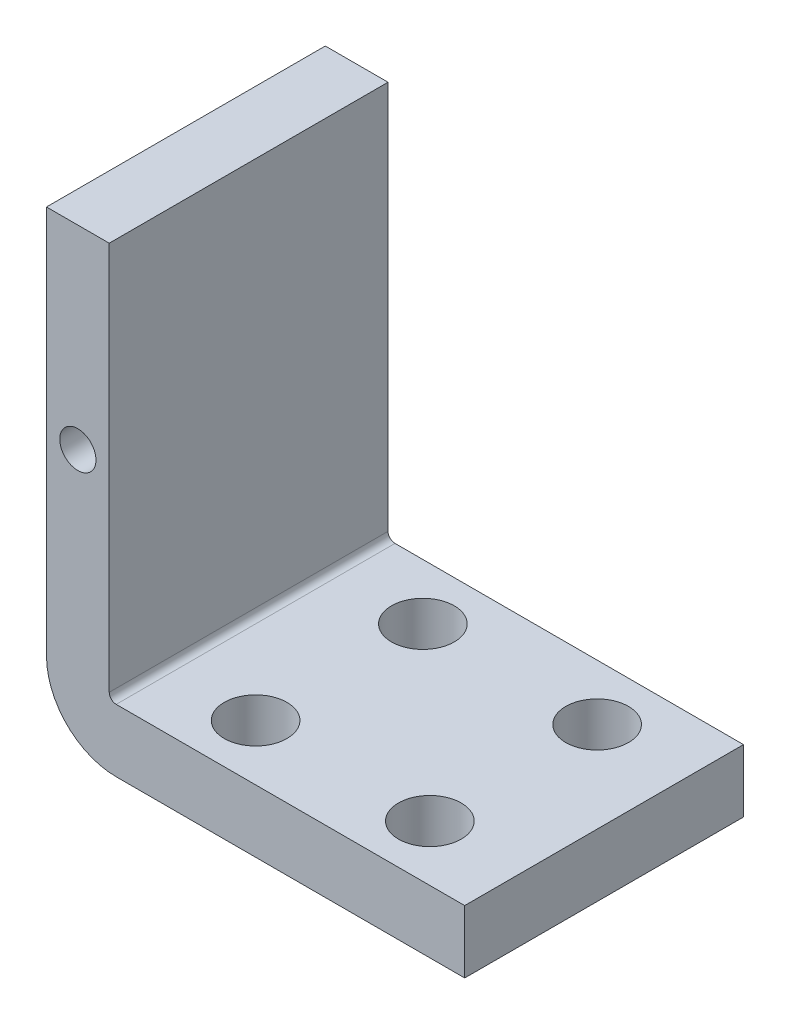
ISO-10303-21;
HEADER;
FILE_DESCRIPTION(('STEP AP214'),'2;1');
FILE_NAME('part.step','',(''),(''),'','','');
FILE_SCHEMA(('AUTOMOTIVE_DESIGN { 1 0 10303 214 1 1 1 1 }'));
ENDSEC;
DATA;
#1=APPLICATION_CONTEXT('core data for automotive mechanical design processes');
#2=APPLICATION_PROTOCOL_DEFINITION('international standard','automotive_design',2000,#1);
#3=PRODUCT_CONTEXT('',#1,'mechanical');
#4=PRODUCT('Part','Part','',(#3));
#5=PRODUCT_RELATED_PRODUCT_CATEGORY('part','',(#4));
#6=PRODUCT_DEFINITION_FORMATION('','',#4);
#7=PRODUCT_DEFINITION_CONTEXT('part definition',#1,'design');
#8=PRODUCT_DEFINITION('design','',#6,#7);
#9=PRODUCT_DEFINITION_SHAPE('','',#8);
#10=(LENGTH_UNIT() NAMED_UNIT(*) SI_UNIT(.MILLI.,.METRE.));
#11=(NAMED_UNIT(*) PLANE_ANGLE_UNIT() SI_UNIT($,.RADIAN.));
#12=(NAMED_UNIT(*) SI_UNIT($,.STERADIAN.) SOLID_ANGLE_UNIT());
#13=UNCERTAINTY_MEASURE_WITH_UNIT(LENGTH_MEASURE(1.E-05),#10,'distance_accuracy_value','');
#14=(GEOMETRIC_REPRESENTATION_CONTEXT(3) GLOBAL_UNCERTAINTY_ASSIGNED_CONTEXT((#13)) GLOBAL_UNIT_ASSIGNED_CONTEXT((#10,
#11,#12)) REPRESENTATION_CONTEXT('',''));
#15=CARTESIAN_POINT('',(0.,0.,0.));
#16=DIRECTION('',(0.,0.,1.));
#17=DIRECTION('',(1.,0.,0.));
#18=AXIS2_PLACEMENT_3D('',#15,#16,#17);
#19=CARTESIAN_POINT('',(0.,-27.9,20.));
#20=DIRECTION('',(0.,0.,1.));
#21=DIRECTION('',(1.,0.,0.));
#22=AXIS2_PLACEMENT_3D('',#19,#20,#21);
#23=PLANE('',#22);
#24=CARTESIAN_POINT('',(5.,-27.9,20.));
#25=DIRECTION('',(0.,0.,1.));
#26=DIRECTION('',(1.,0.,0.));
#27=AXIS2_PLACEMENT_3D('',#24,#25,#26);
#28=CIRCLE('',#27,0.5);
#29=CARTESIAN_POINT('',(4.5,-27.9,20.));
#30=VERTEX_POINT('',#29);
#31=CARTESIAN_POINT('',(5.,-28.4,20.));
#32=VERTEX_POINT('',#31);
#33=EDGE_CURVE('E138',#30,#32,#28,.T.);
#34=ORIENTED_EDGE('',*,*,#33,.F.);
#35=DIRECTION('',(0.,-1.,0.));
#36=VECTOR('',#35,1.);
#37=CARTESIAN_POINT('',(4.5,0.,20.));
#38=LINE('',#37,#36);
#39=CARTESIAN_POINT('',(4.5,0.,20.));
#40=VERTEX_POINT('',#39);
#41=EDGE_CURVE('E144',#40,#30,#38,.T.);
#42=ORIENTED_EDGE('',*,*,#41,.F.);
#43=DIRECTION('',(1.,0.,0.));
#44=VECTOR('',#43,1.);
#45=CARTESIAN_POINT('',(0.,0.,20.));
#46=LINE('',#45,#44);
#47=CARTESIAN_POINT('',(0.,0.,20.));
#48=VERTEX_POINT('',#47);
#49=EDGE_CURVE('E103',#48,#40,#46,.T.);
#50=ORIENTED_EDGE('',*,*,#49,.F.);
#51=DIRECTION('',(0.,-1.,0.));
#52=VECTOR('',#51,1.);
#53=CARTESIAN_POINT('',(0.,0.,20.));
#54=LINE('',#53,#52);
#55=CARTESIAN_POINT('',(0.,-27.9,20.));
#56=VERTEX_POINT('',#55);
#57=EDGE_CURVE('E25',#48,#56,#54,.T.);
#58=ORIENTED_EDGE('',*,*,#57,.T.);
#59=CARTESIAN_POINT('',(5.,-27.9,20.));
#60=DIRECTION('',(0.,0.,1.));
#61=DIRECTION('',(0.,-1.,0.));
#62=AXIS2_PLACEMENT_3D('',#59,#60,#61);
#63=CIRCLE('',#62,5.);
#64=CARTESIAN_POINT('',(5.,-32.9,20.));
#65=VERTEX_POINT('',#64);
#66=EDGE_CURVE('E9',#56,#65,#63,.T.);
#67=ORIENTED_EDGE('',*,*,#66,.T.);
#68=DIRECTION('',(1.,0.,0.));
#69=VECTOR('',#68,1.);
#70=CARTESIAN_POINT('',(5.,-32.9,20.));
#71=LINE('',#70,#69);
#72=CARTESIAN_POINT('',(30.,-32.9,20.));
#73=VERTEX_POINT('',#72);
#74=EDGE_CURVE('E106',#65,#73,#71,.T.);
#75=ORIENTED_EDGE('',*,*,#74,.T.);
#76=DIRECTION('',(0.,-1.,0.));
#77=VECTOR('',#76,1.);
#78=CARTESIAN_POINT('',(30.,-28.4,20.));
#79=LINE('',#78,#77);
#80=CARTESIAN_POINT('',(30.,-28.4,20.));
#81=VERTEX_POINT('',#80);
#82=EDGE_CURVE('E133',#81,#73,#79,.T.);
#83=ORIENTED_EDGE('',*,*,#82,.F.);
#84=DIRECTION('',(1.,0.,0.));
#85=VECTOR('',#84,1.);
#86=CARTESIAN_POINT('',(5.,-28.4,20.));
#87=LINE('',#86,#85);
#88=EDGE_CURVE('E137',#32,#81,#87,.T.);
#89=ORIENTED_EDGE('',*,*,#88,.F.);
#90=EDGE_LOOP('',(#34,#42,#50,#58,#67,#75,#83,#89));
#91=FACE_BOUND('',#90,.T.);
#92=CARTESIAN_POINT('',(2.25,-13.95,20.));
#93=DIRECTION('',(0.,0.,1.));
#94=DIRECTION('',(1.,0.,0.));
#95=AXIS2_PLACEMENT_3D('',#92,#93,#94);
#96=CIRCLE('',#95,1.3);
#97=CARTESIAN_POINT('',(3.55,-13.95,20.));
#98=VERTEX_POINT('',#97);
#99=EDGE_CURVE('E151',#98,#98,#96,.T.);
#100=ORIENTED_EDGE('',*,*,#99,.F.);
#101=EDGE_LOOP('',(#100));
#102=FACE_BOUND('',#101,.T.);
#103=ADVANCED_FACE('F15',(#91,#102),#23,.T.);
#104=CARTESIAN_POINT('',(5.,-32.9,0.));
#105=DIRECTION('',(0.,0.,-1.));
#106=DIRECTION('',(-1.,0.,0.));
#107=AXIS2_PLACEMENT_3D('',#104,#105,#106);
#108=PLANE('',#107);
#109=CARTESIAN_POINT('',(5.,-27.9,0.));
#110=DIRECTION('',(0.,0.,1.));
#111=DIRECTION('',(1.,0.,0.));
#112=AXIS2_PLACEMENT_3D('',#109,#110,#111);
#113=CIRCLE('',#112,0.5);
#114=CARTESIAN_POINT('',(4.5,-27.9,0.));
#115=VERTEX_POINT('',#114);
#116=CARTESIAN_POINT('',(5.,-28.4,0.));
#117=VERTEX_POINT('',#116);
#118=EDGE_CURVE('E170',#115,#117,#113,.T.);
#119=ORIENTED_EDGE('',*,*,#118,.T.);
#120=DIRECTION('',(1.,0.,0.));
#121=VECTOR('',#120,1.);
#122=CARTESIAN_POINT('',(5.,-28.4,0.));
#123=LINE('',#122,#121);
#124=CARTESIAN_POINT('',(30.,-28.4,0.));
#125=VERTEX_POINT('',#124);
#126=EDGE_CURVE('E172',#117,#125,#123,.T.);
#127=ORIENTED_EDGE('',*,*,#126,.T.);
#128=DIRECTION('',(0.,-1.,0.));
#129=VECTOR('',#128,1.);
#130=CARTESIAN_POINT('',(30.,-28.4,0.));
#131=LINE('',#130,#129);
#132=CARTESIAN_POINT('',(30.,-32.9,0.));
#133=VERTEX_POINT('',#132);
#134=EDGE_CURVE('E174',#125,#133,#131,.T.);
#135=ORIENTED_EDGE('',*,*,#134,.T.);
#136=DIRECTION('',(1.,0.,0.));
#137=VECTOR('',#136,1.);
#138=CARTESIAN_POINT('',(5.,-32.9,0.));
#139=LINE('',#138,#137);
#140=CARTESIAN_POINT('',(5.,-32.9,0.));
#141=VERTEX_POINT('',#140);
#142=EDGE_CURVE('E120',#141,#133,#139,.T.);
#143=ORIENTED_EDGE('',*,*,#142,.F.);
#144=CARTESIAN_POINT('',(5.,-27.9,0.));
#145=DIRECTION('',(0.,0.,1.));
#146=DIRECTION('',(0.,-1.,0.));
#147=AXIS2_PLACEMENT_3D('',#144,#145,#146);
#148=CIRCLE('',#147,5.);
#149=CARTESIAN_POINT('',(0.,-27.9,0.));
#150=VERTEX_POINT('',#149);
#151=EDGE_CURVE('E96',#150,#141,#148,.T.);
#152=ORIENTED_EDGE('',*,*,#151,.F.);
#153=DIRECTION('',(0.,-1.,0.));
#154=VECTOR('',#153,1.);
#155=CARTESIAN_POINT('',(0.,0.,0.));
#156=LINE('',#155,#154);
#157=CARTESIAN_POINT('',(0.,0.,0.));
#158=VERTEX_POINT('',#157);
#159=EDGE_CURVE('E94',#158,#150,#156,.T.);
#160=ORIENTED_EDGE('',*,*,#159,.F.);
#161=DIRECTION('',(1.,0.,0.));
#162=VECTOR('',#161,1.);
#163=CARTESIAN_POINT('',(0.,0.,0.));
#164=LINE('',#163,#162);
#165=CARTESIAN_POINT('',(4.5,0.,0.));
#166=VERTEX_POINT('',#165);
#167=EDGE_CURVE('E82',#158,#166,#164,.T.);
#168=ORIENTED_EDGE('',*,*,#167,.T.);
#169=DIRECTION('',(0.,-1.,0.));
#170=VECTOR('',#169,1.);
#171=CARTESIAN_POINT('',(4.5,0.,0.));
#172=LINE('',#171,#170);
#173=EDGE_CURVE('E76',#166,#115,#172,.T.);
#174=ORIENTED_EDGE('',*,*,#173,.T.);
#175=EDGE_LOOP('',(#119,#127,#135,#143,#152,#160,#168,#174));
#176=FACE_BOUND('',#175,.T.);
#177=CARTESIAN_POINT('',(2.25,-13.95,0.));
#178=DIRECTION('',(0.,0.,1.));
#179=DIRECTION('',(1.,0.,0.));
#180=AXIS2_PLACEMENT_3D('',#177,#178,#179);
#181=CIRCLE('',#180,1.3);
#182=CARTESIAN_POINT('',(3.55,-13.95,0.));
#183=VERTEX_POINT('',#182);
#184=EDGE_CURVE('E19',#183,#183,#181,.T.);
#185=ORIENTED_EDGE('',*,*,#184,.T.);
#186=EDGE_LOOP('',(#185));
#187=FACE_BOUND('',#186,.T.);
#188=ADVANCED_FACE('F99',(#176,#187),#108,.T.);
#189=CARTESIAN_POINT('',(0.,-32.9,20.));
#190=DIRECTION('',(0.,1.,0.));
#191=DIRECTION('',(0.,0.,1.));
#192=AXIS2_PLACEMENT_3D('',#189,#190,#191);
#193=PLANE('',#192);
#194=ORIENTED_EDGE('',*,*,#142,.T.);
#195=DIRECTION('',(0.,0.,-1.));
#196=VECTOR('',#195,1.);
#197=CARTESIAN_POINT('',(30.,-32.9,20.));
#198=LINE('',#197,#196);
#199=EDGE_CURVE('E115',#73,#133,#198,.T.);
#200=ORIENTED_EDGE('',*,*,#199,.F.);
#201=ORIENTED_EDGE('',*,*,#74,.F.);
#202=DIRECTION('',(0.,0.,-1.));
#203=VECTOR('',#202,1.);
#204=CARTESIAN_POINT('',(5.,-32.9,20.));
#205=LINE('',#204,#203);
#206=EDGE_CURVE('E117',#65,#141,#205,.T.);
#207=ORIENTED_EDGE('',*,*,#206,.T.);
#208=EDGE_LOOP('',(#194,#200,#201,#207));
#209=FACE_BOUND('',#208,.T.);
#210=CARTESIAN_POINT('',(11.,-32.9,16.));
#211=DIRECTION('',(0.,1.,0.));
#212=DIRECTION('',(1.,0.,0.));
#213=AXIS2_PLACEMENT_3D('',#210,#211,#212);
#214=CIRCLE('',#213,2.25);
#215=CARTESIAN_POINT('',(13.25,-32.9,16.));
#216=VERTEX_POINT('',#215);
#217=EDGE_CURVE('E121',#216,#216,#214,.T.);
#218=ORIENTED_EDGE('',*,*,#217,.T.);
#219=EDGE_LOOP('',(#218));
#220=FACE_BOUND('',#219,.T.);
#221=CARTESIAN_POINT('',(11.,-32.9,4.));
#222=DIRECTION('',(0.,1.,0.));
#223=DIRECTION('',(1.,0.,0.));
#224=AXIS2_PLACEMENT_3D('',#221,#222,#223);
#225=CIRCLE('',#224,2.25);
#226=CARTESIAN_POINT('',(13.25,-32.9,4.));
#227=VERTEX_POINT('',#226);
#228=EDGE_CURVE('E124',#227,#227,#225,.T.);
#229=ORIENTED_EDGE('',*,*,#228,.T.);
#230=EDGE_LOOP('',(#229));
#231=FACE_BOUND('',#230,.T.);
#232=CARTESIAN_POINT('',(23.5,-32.9,4.));
#233=DIRECTION('',(0.,1.,0.));
#234=DIRECTION('',(1.,0.,0.));
#235=AXIS2_PLACEMENT_3D('',#232,#233,#234);
#236=CIRCLE('',#235,2.25);
#237=CARTESIAN_POINT('',(25.75,-32.9,4.));
#238=VERTEX_POINT('',#237);
#239=EDGE_CURVE('E127',#238,#238,#236,.T.);
#240=ORIENTED_EDGE('',*,*,#239,.T.);
#241=EDGE_LOOP('',(#240));
#242=FACE_BOUND('',#241,.T.);
#243=CARTESIAN_POINT('',(23.5,-32.9,16.));
#244=DIRECTION('',(0.,1.,0.));
#245=DIRECTION('',(1.,0.,0.));
#246=AXIS2_PLACEMENT_3D('',#243,#244,#245);
#247=CIRCLE('',#246,2.25);
#248=CARTESIAN_POINT('',(25.75,-32.9,16.));
#249=VERTEX_POINT('',#248);
#250=EDGE_CURVE('E130',#249,#249,#247,.T.);
#251=ORIENTED_EDGE('',*,*,#250,.T.);
#252=EDGE_LOOP('',(#251));
#253=FACE_BOUND('',#252,.T.);
#254=ADVANCED_FACE('F181',(#209,#220,#231,#242,#253),#193,.F.);
#255=CARTESIAN_POINT('',(30.,-28.4,20.));
#256=DIRECTION('',(1.,0.,0.));
#257=DIRECTION('',(0.,0.,-1.));
#258=AXIS2_PLACEMENT_3D('',#255,#256,#257);
#259=PLANE('',#258);
#260=ORIENTED_EDGE('',*,*,#134,.F.);
#261=DIRECTION('',(0.,0.,-1.));
#262=VECTOR('',#261,1.);
#263=CARTESIAN_POINT('',(30.,-28.4,20.));
#264=LINE('',#263,#262);
#265=EDGE_CURVE('E134',#81,#125,#264,.T.);
#266=ORIENTED_EDGE('',*,*,#265,.F.);
#267=ORIENTED_EDGE('',*,*,#82,.T.);
#268=ORIENTED_EDGE('',*,*,#199,.T.);
#269=EDGE_LOOP('',(#260,#266,#267,#268));
#270=FACE_BOUND('',#269,.T.);
#271=ADVANCED_FACE('F179',(#270),#259,.T.);
#272=CARTESIAN_POINT('',(0.,-28.4,20.));
#273=DIRECTION('',(0.,1.,0.));
#274=DIRECTION('',(0.,0.,1.));
#275=AXIS2_PLACEMENT_3D('',#272,#273,#274);
#276=PLANE('',#275);
#277=ORIENTED_EDGE('',*,*,#126,.F.);
#278=DIRECTION('',(0.,0.,-1.));
#279=VECTOR('',#278,1.);
#280=CARTESIAN_POINT('',(5.,-28.4,20.));
#281=LINE('',#280,#279);
#282=EDGE_CURVE('E141',#32,#117,#281,.T.);
#283=ORIENTED_EDGE('',*,*,#282,.F.);
#284=ORIENTED_EDGE('',*,*,#88,.T.);
#285=ORIENTED_EDGE('',*,*,#265,.T.);
#286=EDGE_LOOP('',(#277,#283,#284,#285));
#287=FACE_BOUND('',#286,.T.);
#288=CARTESIAN_POINT('',(11.,-28.4,16.));
#289=DIRECTION('',(0.,1.,0.));
#290=DIRECTION('',(1.,0.,0.));
#291=AXIS2_PLACEMENT_3D('',#288,#289,#290);
#292=CIRCLE('',#291,2.25);
#293=CARTESIAN_POINT('',(13.25,-28.4,16.));
#294=VERTEX_POINT('',#293);
#295=EDGE_CURVE('E147',#294,#294,#292,.T.);
#296=ORIENTED_EDGE('',*,*,#295,.F.);
#297=EDGE_LOOP('',(#296));
#298=FACE_BOUND('',#297,.T.);
#299=CARTESIAN_POINT('',(11.,-28.4,4.));
#300=DIRECTION('',(0.,1.,0.));
#301=DIRECTION('',(1.,0.,0.));
#302=AXIS2_PLACEMENT_3D('',#299,#300,#301);
#303=CIRCLE('',#302,2.25);
#304=CARTESIAN_POINT('',(13.25,-28.4,4.));
#305=VERTEX_POINT('',#304);
#306=EDGE_CURVE('E150',#305,#305,#303,.T.);
#307=ORIENTED_EDGE('',*,*,#306,.F.);
#308=EDGE_LOOP('',(#307));
#309=FACE_BOUND('',#308,.T.);
#310=CARTESIAN_POINT('',(23.5,-28.4,4.));
#311=DIRECTION('',(0.,1.,0.));
#312=DIRECTION('',(1.,0.,0.));
#313=AXIS2_PLACEMENT_3D('',#310,#311,#312);
#314=CIRCLE('',#313,2.25);
#315=CARTESIAN_POINT('',(25.75,-28.4,4.));
#316=VERTEX_POINT('',#315);
#317=EDGE_CURVE('E154',#316,#316,#314,.T.);
#318=ORIENTED_EDGE('',*,*,#317,.F.);
#319=EDGE_LOOP('',(#318));
#320=FACE_BOUND('',#319,.T.);
#321=CARTESIAN_POINT('',(23.5,-28.4,16.));
#322=DIRECTION('',(0.,1.,0.));
#323=DIRECTION('',(1.,0.,0.));
#324=AXIS2_PLACEMENT_3D('',#321,#322,#323);
#325=CIRCLE('',#324,2.25);
#326=CARTESIAN_POINT('',(25.75,-28.4,16.));
#327=VERTEX_POINT('',#326);
#328=EDGE_CURVE('E157',#327,#327,#325,.T.);
#329=ORIENTED_EDGE('',*,*,#328,.F.);
#330=EDGE_LOOP('',(#329));
#331=FACE_BOUND('',#330,.T.);
#332=ADVANCED_FACE('F209',(#287,#298,#309,#320,#331),#276,.T.);
#333=CARTESIAN_POINT('',(5.,-27.9,20.));
#334=DIRECTION('',(0.,0.,-1.));
#335=DIRECTION('',(0.,-1.,0.));
#336=AXIS2_PLACEMENT_3D('',#333,#334,#335);
#337=CYLINDRICAL_SURFACE('',#336,0.5);
#338=ORIENTED_EDGE('',*,*,#118,.F.);
#339=DIRECTION('',(0.,0.,-1.));
#340=VECTOR('',#339,1.);
#341=CARTESIAN_POINT('',(4.5,-27.9,20.));
#342=LINE('',#341,#340);
#343=EDGE_CURVE('E160',#30,#115,#342,.T.);
#344=ORIENTED_EDGE('',*,*,#343,.F.);
#345=ORIENTED_EDGE('',*,*,#33,.T.);
#346=ORIENTED_EDGE('',*,*,#282,.T.);
#347=EDGE_LOOP('',(#338,#344,#345,#346));
#348=FACE_BOUND('',#347,.T.);
#349=ADVANCED_FACE('F212',(#348),#337,.F.);
#350=CARTESIAN_POINT('',(4.5,0.,20.));
#351=DIRECTION('',(1.,0.,0.));
#352=DIRECTION('',(0.,1.,0.));
#353=AXIS2_PLACEMENT_3D('',#350,#351,#352);
#354=PLANE('',#353);
#355=ORIENTED_EDGE('',*,*,#173,.F.);
#356=DIRECTION('',(0.,0.,-1.));
#357=VECTOR('',#356,1.);
#358=CARTESIAN_POINT('',(4.5,0.,20.));
#359=LINE('',#358,#357);
#360=EDGE_CURVE('E86',#40,#166,#359,.T.);
#361=ORIENTED_EDGE('',*,*,#360,.F.);
#362=ORIENTED_EDGE('',*,*,#41,.T.);
#363=ORIENTED_EDGE('',*,*,#343,.T.);
#364=EDGE_LOOP('',(#355,#361,#362,#363));
#365=FACE_BOUND('',#364,.T.);
#366=ADVANCED_FACE('F214',(#365),#354,.T.);
#367=CARTESIAN_POINT('',(0.,0.,20.));
#368=DIRECTION('',(0.,1.,0.));
#369=DIRECTION('',(-1.,0.,0.));
#370=AXIS2_PLACEMENT_3D('',#367,#368,#369);
#371=PLANE('',#370);
#372=ORIENTED_EDGE('',*,*,#167,.F.);
#373=DIRECTION('',(0.,0.,-1.));
#374=VECTOR('',#373,1.);
#375=CARTESIAN_POINT('',(0.,0.,20.));
#376=LINE('',#375,#374);
#377=EDGE_CURVE('E85',#48,#158,#376,.T.);
#378=ORIENTED_EDGE('',*,*,#377,.F.);
#379=ORIENTED_EDGE('',*,*,#49,.T.);
#380=ORIENTED_EDGE('',*,*,#360,.T.);
#381=EDGE_LOOP('',(#372,#378,#379,#380));
#382=FACE_BOUND('',#381,.T.);
#383=ADVANCED_FACE('F84',(#382),#371,.T.);
#384=CARTESIAN_POINT('',(0.,0.,20.));
#385=DIRECTION('',(1.,0.,0.));
#386=DIRECTION('',(0.,1.,0.));
#387=AXIS2_PLACEMENT_3D('',#384,#385,#386);
#388=PLANE('',#387);
#389=ORIENTED_EDGE('',*,*,#159,.T.);
#390=DIRECTION('',(0.,0.,-1.));
#391=VECTOR('',#390,1.);
#392=CARTESIAN_POINT('',(0.,-27.9,20.));
#393=LINE('',#392,#391);
#394=EDGE_CURVE('E105',#56,#150,#393,.T.);
#395=ORIENTED_EDGE('',*,*,#394,.F.);
#396=ORIENTED_EDGE('',*,*,#57,.F.);
#397=ORIENTED_EDGE('',*,*,#377,.T.);
#398=EDGE_LOOP('',(#389,#395,#396,#397));
#399=FACE_BOUND('',#398,.T.);
#400=ADVANCED_FACE('F92',(#399),#388,.F.);
#401=CARTESIAN_POINT('',(5.,-27.9,20.));
#402=DIRECTION('',(0.,0.,-1.));
#403=DIRECTION('',(0.,-1.,0.));
#404=AXIS2_PLACEMENT_3D('',#401,#402,#403);
#405=CYLINDRICAL_SURFACE('',#404,5.);
#406=ORIENTED_EDGE('',*,*,#151,.T.);
#407=ORIENTED_EDGE('',*,*,#206,.F.);
#408=ORIENTED_EDGE('',*,*,#66,.F.);
#409=ORIENTED_EDGE('',*,*,#394,.T.);
#410=EDGE_LOOP('',(#406,#407,#408,#409));
#411=FACE_BOUND('',#410,.T.);
#412=ADVANCED_FACE('F184',(#411),#405,.T.);
#413=CARTESIAN_POINT('',(23.5,-69.4,16.));
#414=DIRECTION('',(0.,1.,0.));
#415=DIRECTION('',(1.,0.,0.));
#416=AXIS2_PLACEMENT_3D('',#413,#414,#415);
#417=CYLINDRICAL_SURFACE('',#416,2.25);
#418=ORIENTED_EDGE('',*,*,#328,.T.);
#419=EDGE_LOOP('',(#418));
#420=FACE_BOUND('',#419,.T.);
#421=ORIENTED_EDGE('',*,*,#250,.F.);
#422=EDGE_LOOP('',(#421));
#423=FACE_BOUND('',#422,.T.);
#424=ADVANCED_FACE('F223',(#420,#423),#417,.F.);
#425=CARTESIAN_POINT('',(23.5,-69.4,4.));
#426=DIRECTION('',(0.,1.,0.));
#427=DIRECTION('',(1.,0.,0.));
#428=AXIS2_PLACEMENT_3D('',#425,#426,#427);
#429=CYLINDRICAL_SURFACE('',#428,2.25);
#430=ORIENTED_EDGE('',*,*,#317,.T.);
#431=EDGE_LOOP('',(#430));
#432=FACE_BOUND('',#431,.T.);
#433=ORIENTED_EDGE('',*,*,#239,.F.);
#434=EDGE_LOOP('',(#433));
#435=FACE_BOUND('',#434,.T.);
#436=ADVANCED_FACE('F227',(#432,#435),#429,.F.);
#437=CARTESIAN_POINT('',(11.,-69.4,4.));
#438=DIRECTION('',(0.,1.,0.));
#439=DIRECTION('',(1.,0.,0.));
#440=AXIS2_PLACEMENT_3D('',#437,#438,#439);
#441=CYLINDRICAL_SURFACE('',#440,2.25);
#442=ORIENTED_EDGE('',*,*,#306,.T.);
#443=EDGE_LOOP('',(#442));
#444=FACE_BOUND('',#443,.T.);
#445=ORIENTED_EDGE('',*,*,#228,.F.);
#446=EDGE_LOOP('',(#445));
#447=FACE_BOUND('',#446,.T.);
#448=ADVANCED_FACE('F17',(#444,#447),#441,.F.);
#449=CARTESIAN_POINT('',(11.,-69.4,16.));
#450=DIRECTION('',(0.,1.,0.));
#451=DIRECTION('',(1.,0.,0.));
#452=AXIS2_PLACEMENT_3D('',#449,#450,#451);
#453=CYLINDRICAL_SURFACE('',#452,2.25);
#454=ORIENTED_EDGE('',*,*,#295,.T.);
#455=EDGE_LOOP('',(#454));
#456=FACE_BOUND('',#455,.T.);
#457=ORIENTED_EDGE('',*,*,#217,.F.);
#458=EDGE_LOOP('',(#457));
#459=FACE_BOUND('',#458,.T.);
#460=ADVANCED_FACE('F196',(#456,#459),#453,.F.);
#461=CARTESIAN_POINT('',(2.25,-13.95,-12.));
#462=DIRECTION('',(0.,0.,1.));
#463=DIRECTION('',(1.,0.,0.));
#464=AXIS2_PLACEMENT_3D('',#461,#462,#463);
#465=CYLINDRICAL_SURFACE('',#464,1.3);
#466=ORIENTED_EDGE('',*,*,#99,.T.);
#467=EDGE_LOOP('',(#466));
#468=FACE_BOUND('',#467,.T.);
#469=ORIENTED_EDGE('',*,*,#184,.F.);
#470=EDGE_LOOP('',(#469));
#471=FACE_BOUND('',#470,.T.);
#472=ADVANCED_FACE('F193',(#468,#471),#465,.F.);
#473=CLOSED_SHELL('',(#103,#188,#254,#271,#332,#349,#366,#383,#400,#412,#424,#436,#448,#460,#472));
#474=MANIFOLD_SOLID_BREP('B1',#473);
#475=ADVANCED_BREP_SHAPE_REPRESENTATION('',(#18,#474),#14);
#476=SHAPE_DEFINITION_REPRESENTATION(#9,#475);
ENDSEC;
END-ISO-10303-21;
